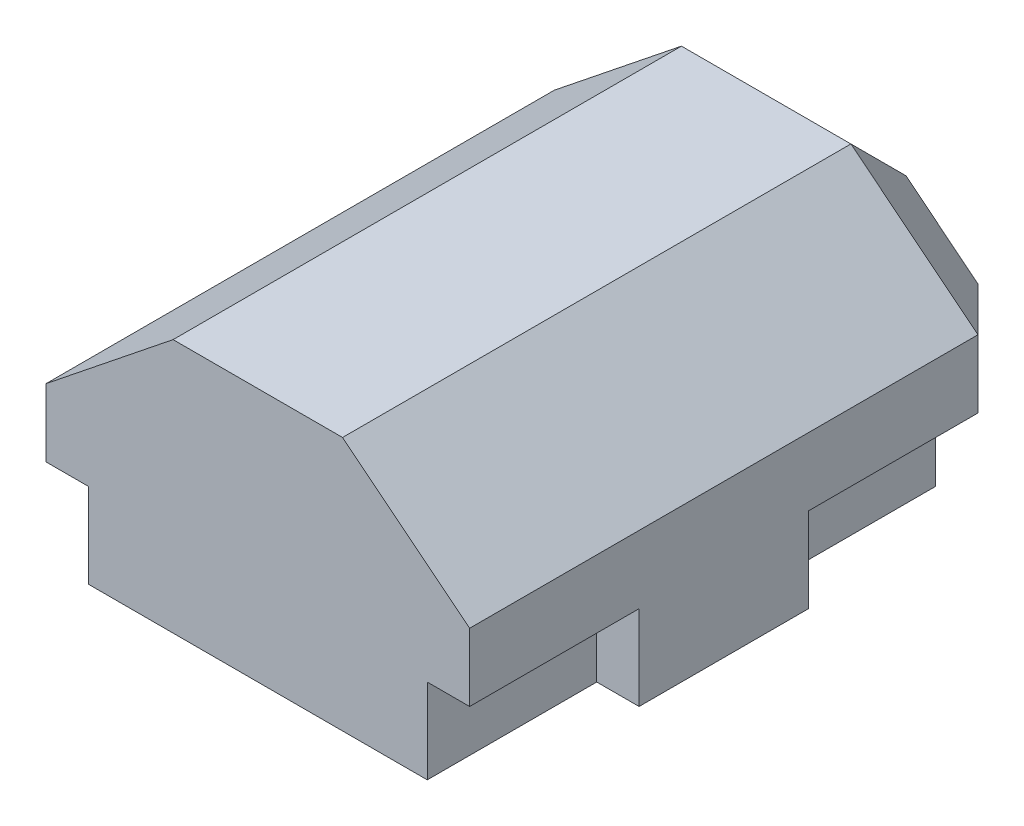
ISO-10303-21;
HEADER;
FILE_DESCRIPTION(('STEP AP214'),'2;1');
FILE_NAME('part.step','',(''),(''),'','','');
FILE_SCHEMA(('AUTOMOTIVE_DESIGN { 1 0 10303 214 1 1 1 1 }'));
ENDSEC;
DATA;
#1=APPLICATION_CONTEXT('core data for automotive mechanical design processes');
#2=APPLICATION_PROTOCOL_DEFINITION('international standard','automotive_design',2000,#1);
#3=PRODUCT_CONTEXT('',#1,'mechanical');
#4=PRODUCT('Part','Part','',(#3));
#5=PRODUCT_RELATED_PRODUCT_CATEGORY('part','',(#4));
#6=PRODUCT_DEFINITION_FORMATION('','',#4);
#7=PRODUCT_DEFINITION_CONTEXT('part definition',#1,'design');
#8=PRODUCT_DEFINITION('design','',#6,#7);
#9=PRODUCT_DEFINITION_SHAPE('','',#8);
#10=(LENGTH_UNIT() NAMED_UNIT(*) SI_UNIT(.MILLI.,.METRE.));
#11=(NAMED_UNIT(*) PLANE_ANGLE_UNIT() SI_UNIT($,.RADIAN.));
#12=(NAMED_UNIT(*) SI_UNIT($,.STERADIAN.) SOLID_ANGLE_UNIT());
#13=UNCERTAINTY_MEASURE_WITH_UNIT(LENGTH_MEASURE(1.E-05),#10,'distance_accuracy_value','');
#14=(GEOMETRIC_REPRESENTATION_CONTEXT(3) GLOBAL_UNCERTAINTY_ASSIGNED_CONTEXT((#13)) GLOBAL_UNIT_ASSIGNED_CONTEXT((#10,
#11,#12)) REPRESENTATION_CONTEXT('',''));
#15=CARTESIAN_POINT('',(0.,0.,0.));
#16=DIRECTION('',(0.,0.,1.));
#17=DIRECTION('',(1.,0.,0.));
#18=AXIS2_PLACEMENT_3D('',#15,#16,#17);
#19=CARTESIAN_POINT('',(0.,0.,0.));
#20=DIRECTION('',(0.,0.,1.));
#21=DIRECTION('',(1.,0.,0.));
#22=AXIS2_PLACEMENT_3D('',#19,#20,#21);
#23=PLANE('',#22);
#24=DIRECTION('',(-1.,0.,0.));
#25=VECTOR('',#24,1.);
#26=CARTESIAN_POINT('',(200.,-50.,0.));
#27=LINE('',#26,#25);
#28=CARTESIAN_POINT('',(200.,-50.,0.));
#29=VERTEX_POINT('',#28);
#30=CARTESIAN_POINT('',(-200.,-50.,0.));
#31=VERTEX_POINT('',#30);
#32=EDGE_CURVE('E181',#29,#31,#27,.T.);
#33=ORIENTED_EDGE('',*,*,#32,.F.);
#34=DIRECTION('',(0.,1.,0.));
#35=VECTOR('',#34,1.);
#36=CARTESIAN_POINT('',(200.,-50.,0.));
#37=LINE('',#36,#35);
#38=CARTESIAN_POINT('',(200.,-150.,0.));
#39=VERTEX_POINT('',#38);
#40=EDGE_CURVE('E185',#39,#29,#37,.T.);
#41=ORIENTED_EDGE('',*,*,#40,.F.);
#42=DIRECTION('',(1.,0.,0.));
#43=VECTOR('',#42,1.);
#44=CARTESIAN_POINT('',(200.,-150.,0.));
#45=LINE('',#44,#43);
#46=CARTESIAN_POINT('',(-200.,-150.,0.));
#47=VERTEX_POINT('',#46);
#48=EDGE_CURVE('E212',#47,#39,#45,.T.);
#49=ORIENTED_EDGE('',*,*,#48,.F.);
#50=DIRECTION('',(0.,-1.,0.));
#51=VECTOR('',#50,1.);
#52=CARTESIAN_POINT('',(-200.,-50.,0.));
#53=LINE('',#52,#51);
#54=EDGE_CURVE('E187',#31,#47,#53,.T.);
#55=ORIENTED_EDGE('',*,*,#54,.F.);
#56=EDGE_LOOP('',(#33,#41,#49,#55));
#57=FACE_BOUND('',#56,.T.);
#58=ADVANCED_FACE('F35',(#57),#23,.F.);
#59=CARTESIAN_POINT('',(-250.,-50.,600.));
#60=DIRECTION('',(0.,1.,0.));
#61=DIRECTION('',(0.,0.,1.));
#62=AXIS2_PLACEMENT_3D('',#59,#60,#61);
#63=PLANE('',#62);
#64=DIRECTION('',(0.,0.,-1.));
#65=VECTOR('',#64,1.);
#66=CARTESIAN_POINT('',(-250.,-50.,600.));
#67=LINE('',#66,#65);
#68=CARTESIAN_POINT('',(-250.,-50.,600.));
#69=VERTEX_POINT('',#68);
#70=CARTESIAN_POINT('',(-250.,-50.,400.));
#71=VERTEX_POINT('',#70);
#72=EDGE_CURVE('E192',#69,#71,#67,.T.);
#73=ORIENTED_EDGE('',*,*,#72,.T.);
#74=DIRECTION('',(-1.,0.,0.));
#75=VECTOR('',#74,1.);
#76=CARTESIAN_POINT('',(250.,-50.,400.));
#77=LINE('',#76,#75);
#78=CARTESIAN_POINT('',(-200.,-50.,400.));
#79=VERTEX_POINT('',#78);
#80=EDGE_CURVE('E312',#79,#71,#77,.T.);
#81=ORIENTED_EDGE('',*,*,#80,.F.);
#82=DIRECTION('',(0.,0.,-1.));
#83=VECTOR('',#82,1.);
#84=CARTESIAN_POINT('',(-200.,-50.,600.));
#85=LINE('',#84,#83);
#86=CARTESIAN_POINT('',(-200.,-50.,600.));
#87=VERTEX_POINT('',#86);
#88=EDGE_CURVE('E243',#87,#79,#85,.T.);
#89=ORIENTED_EDGE('',*,*,#88,.F.);
#90=DIRECTION('',(1.,0.,0.));
#91=VECTOR('',#90,1.);
#92=CARTESIAN_POINT('',(-250.,-50.,600.));
#93=LINE('',#92,#91);
#94=EDGE_CURVE('E215',#69,#87,#93,.T.);
#95=ORIENTED_EDGE('',*,*,#94,.F.);
#96=EDGE_LOOP('',(#73,#81,#89,#95));
#97=FACE_BOUND('',#96,.T.);
#98=ADVANCED_FACE('F385',(#97),#63,.F.);
#99=CARTESIAN_POINT('',(-200.,-50.,600.));
#100=DIRECTION('',(1.,0.,0.));
#101=DIRECTION('',(0.,0.,-1.));
#102=AXIS2_PLACEMENT_3D('',#99,#100,#101);
#103=PLANE('',#102);
#104=ORIENTED_EDGE('',*,*,#88,.T.);
#105=DIRECTION('',(0.,-1.,0.));
#106=VECTOR('',#105,1.);
#107=CARTESIAN_POINT('',(-200.,-49.9999999999999,400.));
#108=LINE('',#107,#106);
#109=CARTESIAN_POINT('',(-200.,-150.,400.));
#110=VERTEX_POINT('',#109);
#111=EDGE_CURVE('E328',#79,#110,#108,.T.);
#112=ORIENTED_EDGE('',*,*,#111,.T.);
#113=DIRECTION('',(0.,0.,-1.));
#114=VECTOR('',#113,1.);
#115=CARTESIAN_POINT('',(-200.,-150.,600.));
#116=LINE('',#115,#114);
#117=CARTESIAN_POINT('',(-200.,-150.,600.));
#118=VERTEX_POINT('',#117);
#119=EDGE_CURVE('E239',#118,#110,#116,.T.);
#120=ORIENTED_EDGE('',*,*,#119,.F.);
#121=DIRECTION('',(0.,-1.,0.));
#122=VECTOR('',#121,1.);
#123=CARTESIAN_POINT('',(-200.,-50.,600.));
#124=LINE('',#123,#122);
#125=EDGE_CURVE('E332',#87,#118,#124,.T.);
#126=ORIENTED_EDGE('',*,*,#125,.F.);
#127=EDGE_LOOP('',(#104,#112,#120,#126));
#128=FACE_BOUND('',#127,.T.);
#129=ADVANCED_FACE('F390',(#128),#103,.F.);
#130=CARTESIAN_POINT('',(200.,-50.,600.));
#131=DIRECTION('',(-1.,0.,0.));
#132=DIRECTION('',(0.,0.,1.));
#133=AXIS2_PLACEMENT_3D('',#130,#131,#132);
#134=PLANE('',#133);
#135=DIRECTION('',(0.,0.,-1.));
#136=VECTOR('',#135,1.);
#137=CARTESIAN_POINT('',(200.,-150.,600.));
#138=LINE('',#137,#136);
#139=CARTESIAN_POINT('',(200.,-150.,600.));
#140=VERTEX_POINT('',#139);
#141=CARTESIAN_POINT('',(200.,-150.,400.));
#142=VERTEX_POINT('',#141);
#143=EDGE_CURVE('E235',#140,#142,#138,.T.);
#144=ORIENTED_EDGE('',*,*,#143,.T.);
#145=DIRECTION('',(0.,1.,0.));
#146=VECTOR('',#145,1.);
#147=CARTESIAN_POINT('',(200.,-49.9999999999999,400.));
#148=LINE('',#147,#146);
#149=CARTESIAN_POINT('',(200.,-50.,400.));
#150=VERTEX_POINT('',#149);
#151=EDGE_CURVE('E325',#142,#150,#148,.T.);
#152=ORIENTED_EDGE('',*,*,#151,.T.);
#153=DIRECTION('',(0.,0.,-1.));
#154=VECTOR('',#153,1.);
#155=CARTESIAN_POINT('',(200.,-50.,600.));
#156=LINE('',#155,#154);
#157=CARTESIAN_POINT('',(200.,-50.,600.));
#158=VERTEX_POINT('',#157);
#159=EDGE_CURVE('E204',#158,#150,#156,.T.);
#160=ORIENTED_EDGE('',*,*,#159,.F.);
#161=DIRECTION('',(0.,1.,0.));
#162=VECTOR('',#161,1.);
#163=CARTESIAN_POINT('',(200.,-50.,600.));
#164=LINE('',#163,#162);
#165=EDGE_CURVE('E336',#140,#158,#164,.T.);
#166=ORIENTED_EDGE('',*,*,#165,.F.);
#167=EDGE_LOOP('',(#144,#152,#160,#166));
#168=FACE_BOUND('',#167,.T.);
#169=ADVANCED_FACE('F415',(#168),#134,.F.);
#170=CARTESIAN_POINT('',(250.,-50.,600.));
#171=DIRECTION('',(0.,1.,0.));
#172=DIRECTION('',(0.,0.,1.));
#173=AXIS2_PLACEMENT_3D('',#170,#171,#172);
#174=PLANE('',#173);
#175=ORIENTED_EDGE('',*,*,#159,.T.);
#176=CARTESIAN_POINT('',(250.,-50.,400.));
#177=VERTEX_POINT('',#176);
#178=EDGE_CURVE('E309',#177,#150,#77,.T.);
#179=ORIENTED_EDGE('',*,*,#178,.F.);
#180=DIRECTION('',(0.,0.,-1.));
#181=VECTOR('',#180,1.);
#182=CARTESIAN_POINT('',(250.,-50.,600.));
#183=LINE('',#182,#181);
#184=CARTESIAN_POINT('',(250.,-50.,600.));
#185=VERTEX_POINT('',#184);
#186=EDGE_CURVE('E205',#185,#177,#183,.T.);
#187=ORIENTED_EDGE('',*,*,#186,.F.);
#188=DIRECTION('',(1.,0.,0.));
#189=VECTOR('',#188,1.);
#190=CARTESIAN_POINT('',(250.,-50.,600.));
#191=LINE('',#190,#189);
#192=EDGE_CURVE('E338',#158,#185,#191,.T.);
#193=ORIENTED_EDGE('',*,*,#192,.F.);
#194=EDGE_LOOP('',(#175,#179,#187,#193));
#195=FACE_BOUND('',#194,.T.);
#196=ADVANCED_FACE('F412',(#195),#174,.F.);
#197=CARTESIAN_POINT('',(-250.,-50.,600.));
#198=DIRECTION('',(1.,0.,0.));
#199=DIRECTION('',(0.,0.,-1.));
#200=AXIS2_PLACEMENT_3D('',#197,#198,#199);
#201=PLANE('',#200);
#202=DIRECTION('',(0.,0.,-1.));
#203=VECTOR('',#202,1.);
#204=CARTESIAN_POINT('',(-250.,30.,600.));
#205=LINE('',#204,#203);
#206=CARTESIAN_POINT('',(-250.,30.,600.));
#207=VERTEX_POINT('',#206);
#208=CARTESIAN_POINT('',(-250.,30.,3.33066907387547E-13));
#209=VERTEX_POINT('',#208);
#210=EDGE_CURVE('E220',#207,#209,#205,.T.);
#211=ORIENTED_EDGE('',*,*,#210,.T.);
#212=DIRECTION('',(0.,-1.,0.));
#213=VECTOR('',#212,1.);
#214=CARTESIAN_POINT('',(-250.,-50.,3.19189119579733E-13));
#215=LINE('',#214,#213);
#216=CARTESIAN_POINT('',(-250.,-50.,3.33066907387547E-13));
#217=VERTEX_POINT('',#216);
#218=EDGE_CURVE('E259',#209,#217,#215,.T.);
#219=ORIENTED_EDGE('',*,*,#218,.T.);
#220=CARTESIAN_POINT('',(-250.,-50.,200.));
#221=VERTEX_POINT('',#220);
#222=EDGE_CURVE('E246',#221,#217,#67,.T.);
#223=ORIENTED_EDGE('',*,*,#222,.F.);
#224=DIRECTION('',(0.,-1.,0.));
#225=VECTOR('',#224,1.);
#226=CARTESIAN_POINT('',(-250.,-50.,200.));
#227=LINE('',#226,#225);
#228=CARTESIAN_POINT('',(-250.,-150.,200.));
#229=VERTEX_POINT('',#228);
#230=EDGE_CURVE('E286',#221,#229,#227,.T.);
#231=ORIENTED_EDGE('',*,*,#230,.T.);
#232=DIRECTION('',(0.,0.,1.));
#233=VECTOR('',#232,1.);
#234=CARTESIAN_POINT('',(-250.,-150.,200.));
#235=LINE('',#234,#233);
#236=CARTESIAN_POINT('',(-250.,-150.,400.));
#237=VERTEX_POINT('',#236);
#238=EDGE_CURVE('E292',#229,#237,#235,.T.);
#239=ORIENTED_EDGE('',*,*,#238,.T.);
#240=DIRECTION('',(0.,1.,0.));
#241=VECTOR('',#240,1.);
#242=CARTESIAN_POINT('',(-250.,-150.,400.));
#243=LINE('',#242,#241);
#244=EDGE_CURVE('E299',#237,#71,#243,.T.);
#245=ORIENTED_EDGE('',*,*,#244,.T.);
#246=ORIENTED_EDGE('',*,*,#72,.F.);
#247=DIRECTION('',(0.,-1.,0.));
#248=VECTOR('',#247,1.);
#249=CARTESIAN_POINT('',(-250.,-50.,600.));
#250=LINE('',#249,#248);
#251=EDGE_CURVE('E211',#207,#69,#250,.T.);
#252=ORIENTED_EDGE('',*,*,#251,.F.);
#253=EDGE_LOOP('',(#211,#219,#223,#231,#239,#245,#246,#252));
#254=FACE_BOUND('',#253,.T.);
#255=ADVANCED_FACE('F359',(#254),#201,.F.);
#256=CARTESIAN_POINT('',(-200.,-150.,200.));
#257=VERTEX_POINT('',#256);
#258=EDGE_CURVE('E238',#257,#47,#116,.T.);
#259=ORIENTED_EDGE('',*,*,#258,.F.);
#260=DIRECTION('',(0.,1.,0.));
#261=VECTOR('',#260,1.);
#262=CARTESIAN_POINT('',(-200.,-50.,200.));
#263=LINE('',#262,#261);
#264=CARTESIAN_POINT('',(-200.,-50.,200.));
#265=VERTEX_POINT('',#264);
#266=EDGE_CURVE('E322',#257,#265,#263,.T.);
#267=ORIENTED_EDGE('',*,*,#266,.T.);
#268=EDGE_CURVE('E242',#265,#31,#85,.T.);
#269=ORIENTED_EDGE('',*,*,#268,.T.);
#270=ORIENTED_EDGE('',*,*,#54,.T.);
#271=EDGE_LOOP('',(#259,#267,#269,#270));
#272=FACE_BOUND('',#271,.T.);
#273=ADVANCED_FACE('F348',(#272),#103,.F.);
#274=CARTESIAN_POINT('',(200.,-150.,600.));
#275=DIRECTION('',(0.,1.,0.));
#276=DIRECTION('',(0.,0.,1.));
#277=AXIS2_PLACEMENT_3D('',#274,#275,#276);
#278=PLANE('',#277);
#279=CARTESIAN_POINT('',(200.,-150.,200.));
#280=VERTEX_POINT('',#279);
#281=EDGE_CURVE('E209',#280,#39,#138,.T.);
#282=ORIENTED_EDGE('',*,*,#281,.F.);
#283=DIRECTION('',(-1.,0.,0.));
#284=VECTOR('',#283,1.);
#285=CARTESIAN_POINT('',(250.,-150.,200.));
#286=LINE('',#285,#284);
#287=CARTESIAN_POINT('',(250.,-150.,200.));
#288=VERTEX_POINT('',#287);
#289=EDGE_CURVE('E317',#288,#280,#286,.T.);
#290=ORIENTED_EDGE('',*,*,#289,.F.);
#291=DIRECTION('',(0.,0.,1.));
#292=VECTOR('',#291,1.);
#293=CARTESIAN_POINT('',(250.,-150.,200.));
#294=LINE('',#293,#292);
#295=CARTESIAN_POINT('',(250.,-150.,400.));
#296=VERTEX_POINT('',#295);
#297=EDGE_CURVE('E298',#288,#296,#294,.T.);
#298=ORIENTED_EDGE('',*,*,#297,.T.);
#299=DIRECTION('',(-1.,0.,0.));
#300=VECTOR('',#299,1.);
#301=CARTESIAN_POINT('',(250.,-150.,400.));
#302=LINE('',#301,#300);
#303=EDGE_CURVE('E313',#296,#142,#302,.T.);
#304=ORIENTED_EDGE('',*,*,#303,.T.);
#305=ORIENTED_EDGE('',*,*,#143,.F.);
#306=DIRECTION('',(1.,0.,0.));
#307=VECTOR('',#306,1.);
#308=CARTESIAN_POINT('',(200.,-150.,600.));
#309=LINE('',#308,#307);
#310=EDGE_CURVE('E334',#118,#140,#309,.T.);
#311=ORIENTED_EDGE('',*,*,#310,.F.);
#312=ORIENTED_EDGE('',*,*,#119,.T.);
#313=EDGE_CURVE('E316',#110,#237,#302,.T.);
#314=ORIENTED_EDGE('',*,*,#313,.T.);
#315=ORIENTED_EDGE('',*,*,#238,.F.);
#316=EDGE_CURVE('E319',#257,#229,#286,.T.);
#317=ORIENTED_EDGE('',*,*,#316,.F.);
#318=ORIENTED_EDGE('',*,*,#258,.T.);
#319=ORIENTED_EDGE('',*,*,#48,.T.);
#320=EDGE_LOOP('',(#282,#290,#298,#304,#305,#311,#312,#314,#315,#317,#318,#319));
#321=FACE_BOUND('',#320,.T.);
#322=ADVANCED_FACE('F350',(#321),#278,.F.);
#323=CARTESIAN_POINT('',(200.,-50.,200.));
#324=VERTEX_POINT('',#323);
#325=EDGE_CURVE('E196',#324,#29,#156,.T.);
#326=ORIENTED_EDGE('',*,*,#325,.F.);
#327=DIRECTION('',(0.,-1.,0.));
#328=VECTOR('',#327,1.);
#329=CARTESIAN_POINT('',(200.,-50.,200.));
#330=LINE('',#329,#328);
#331=EDGE_CURVE('E311',#324,#280,#330,.T.);
#332=ORIENTED_EDGE('',*,*,#331,.T.);
#333=ORIENTED_EDGE('',*,*,#281,.T.);
#334=ORIENTED_EDGE('',*,*,#40,.T.);
#335=EDGE_LOOP('',(#326,#332,#333,#334));
#336=FACE_BOUND('',#335,.T.);
#337=ADVANCED_FACE('F207',(#336),#134,.F.);
#338=ORIENTED_EDGE('',*,*,#222,.T.);
#339=DIRECTION('',(0.707106781186546,0.,-0.707106781186549));
#340=VECTOR('',#339,1.);
#341=CARTESIAN_POINT('',(-150.,-50.,-100.));
#342=LINE('',#341,#340);
#343=CARTESIAN_POINT('',(-150.,-50.,-100.));
#344=VERTEX_POINT('',#343);
#345=EDGE_CURVE('E263',#217,#344,#342,.T.);
#346=ORIENTED_EDGE('',*,*,#345,.T.);
#347=DIRECTION('',(-1.,0.,0.));
#348=VECTOR('',#347,1.);
#349=CARTESIAN_POINT('',(-200.,-50.,-100.));
#350=LINE('',#349,#348);
#351=CARTESIAN_POINT('',(150.,-50.,-100.));
#352=VERTEX_POINT('',#351);
#353=EDGE_CURVE('E281',#352,#344,#350,.T.);
#354=ORIENTED_EDGE('',*,*,#353,.F.);
#355=DIRECTION('',(0.707106781186546,0.,0.707106781186549));
#356=VECTOR('',#355,1.);
#357=CARTESIAN_POINT('',(150.,-50.,-100.));
#358=LINE('',#357,#356);
#359=CARTESIAN_POINT('',(250.,-50.,3.33066907387547E-13));
#360=VERTEX_POINT('',#359);
#361=EDGE_CURVE('E261',#352,#360,#358,.T.);
#362=ORIENTED_EDGE('',*,*,#361,.T.);
#363=CARTESIAN_POINT('',(250.,-50.,200.));
#364=VERTEX_POINT('',#363);
#365=EDGE_CURVE('E231',#364,#360,#183,.T.);
#366=ORIENTED_EDGE('',*,*,#365,.F.);
#367=DIRECTION('',(-1.,0.,0.));
#368=VECTOR('',#367,1.);
#369=CARTESIAN_POINT('',(250.,-50.,200.));
#370=LINE('',#369,#368);
#371=EDGE_CURVE('E201',#364,#324,#370,.T.);
#372=ORIENTED_EDGE('',*,*,#371,.T.);
#373=ORIENTED_EDGE('',*,*,#325,.T.);
#374=ORIENTED_EDGE('',*,*,#32,.T.);
#375=ORIENTED_EDGE('',*,*,#268,.F.);
#376=EDGE_CURVE('E303',#265,#221,#370,.T.);
#377=ORIENTED_EDGE('',*,*,#376,.T.);
#378=EDGE_LOOP('',(#338,#346,#354,#362,#366,#372,#373,#374,#375,#377));
#379=FACE_BOUND('',#378,.T.);
#380=ADVANCED_FACE('F198',(#379),#174,.F.);
#381=CARTESIAN_POINT('',(250.,-50.,600.));
#382=DIRECTION('',(-1.,0.,0.));
#383=DIRECTION('',(0.,0.,1.));
#384=AXIS2_PLACEMENT_3D('',#381,#382,#383);
#385=PLANE('',#384);
#386=ORIENTED_EDGE('',*,*,#365,.T.);
#387=DIRECTION('',(0.,1.,0.));
#388=VECTOR('',#387,1.);
#389=CARTESIAN_POINT('',(250.,30.,3.19189119579733E-13));
#390=LINE('',#389,#388);
#391=CARTESIAN_POINT('',(250.,30.,3.33066907387547E-13));
#392=VERTEX_POINT('',#391);
#393=EDGE_CURVE('E45',#360,#392,#390,.T.);
#394=ORIENTED_EDGE('',*,*,#393,.T.);
#395=DIRECTION('',(0.,0.,-1.));
#396=VECTOR('',#395,1.);
#397=CARTESIAN_POINT('',(250.,30.,600.));
#398=LINE('',#397,#396);
#399=CARTESIAN_POINT('',(250.,30.,600.));
#400=VERTEX_POINT('',#399);
#401=EDGE_CURVE('E229',#400,#392,#398,.T.);
#402=ORIENTED_EDGE('',*,*,#401,.F.);
#403=DIRECTION('',(0.,1.,0.));
#404=VECTOR('',#403,1.);
#405=CARTESIAN_POINT('',(250.,-50.,600.));
#406=LINE('',#405,#404);
#407=EDGE_CURVE('E340',#185,#400,#406,.T.);
#408=ORIENTED_EDGE('',*,*,#407,.F.);
#409=ORIENTED_EDGE('',*,*,#186,.T.);
#410=DIRECTION('',(0.,1.,0.));
#411=VECTOR('',#410,1.);
#412=CARTESIAN_POINT('',(250.,-150.,400.));
#413=LINE('',#412,#411);
#414=EDGE_CURVE('E302',#296,#177,#413,.T.);
#415=ORIENTED_EDGE('',*,*,#414,.F.);
#416=ORIENTED_EDGE('',*,*,#297,.F.);
#417=DIRECTION('',(0.,-1.,0.));
#418=VECTOR('',#417,1.);
#419=CARTESIAN_POINT('',(250.,-50.,200.));
#420=LINE('',#419,#418);
#421=EDGE_CURVE('E295',#364,#288,#420,.T.);
#422=ORIENTED_EDGE('',*,*,#421,.F.);
#423=EDGE_LOOP('',(#386,#394,#402,#408,#409,#415,#416,#422));
#424=FACE_BOUND('',#423,.T.);
#425=ADVANCED_FACE('F407',(#424),#385,.F.);
#426=CARTESIAN_POINT('',(250.,30.,600.));
#427=DIRECTION('',(-0.624695047554425,-0.78086880944303,0.));
#428=DIRECTION('',(0.78086880944303,-0.624695047554425,0.));
#429=AXIS2_PLACEMENT_3D('',#426,#427,#428);
#430=PLANE('',#429);
#431=ORIENTED_EDGE('',*,*,#401,.T.);
#432=DIRECTION('',(-0.78086880944303,0.624695047554425,0.));
#433=VECTOR('',#432,1.);
#434=CARTESIAN_POINT('',(100.,150.,3.44563643239012E-13));
#435=LINE('',#434,#433);
#436=CARTESIAN_POINT('',(100.,150.,3.33066907387547E-13));
#437=VERTEX_POINT('',#436);
#438=EDGE_CURVE('E11',#392,#437,#435,.T.);
#439=ORIENTED_EDGE('',*,*,#438,.T.);
#440=DIRECTION('',(0.,0.,-1.));
#441=VECTOR('',#440,1.);
#442=CARTESIAN_POINT('',(100.,150.,600.));
#443=LINE('',#442,#441);
#444=CARTESIAN_POINT('',(100.,150.,600.));
#445=VERTEX_POINT('',#444);
#446=EDGE_CURVE('E227',#445,#437,#443,.T.);
#447=ORIENTED_EDGE('',*,*,#446,.F.);
#448=DIRECTION('',(-0.78086880944303,0.624695047554425,0.));
#449=VECTOR('',#448,1.);
#450=CARTESIAN_POINT('',(250.,30.,600.));
#451=LINE('',#450,#449);
#452=EDGE_CURVE('E342',#400,#445,#451,.T.);
#453=ORIENTED_EDGE('',*,*,#452,.F.);
#454=EDGE_LOOP('',(#431,#439,#447,#453));
#455=FACE_BOUND('',#454,.T.);
#456=ADVANCED_FACE('F403',(#455),#430,.F.);
#457=CARTESIAN_POINT('',(100.,150.,600.));
#458=DIRECTION('',(0.,-1.,0.));
#459=DIRECTION('',(0.,0.,-1.));
#460=AXIS2_PLACEMENT_3D('',#457,#458,#459);
#461=PLANE('',#460);
#462=ORIENTED_EDGE('',*,*,#446,.T.);
#463=DIRECTION('',(-1.,0.,0.));
#464=VECTOR('',#463,1.);
#465=CARTESIAN_POINT('',(-100.,150.,3.19189119579733E-13));
#466=LINE('',#465,#464);
#467=CARTESIAN_POINT('',(-100.,150.,3.33066907387547E-13));
#468=VERTEX_POINT('',#467);
#469=EDGE_CURVE('E267',#437,#468,#466,.T.);
#470=ORIENTED_EDGE('',*,*,#469,.T.);
#471=DIRECTION('',(0.,0.,-1.));
#472=VECTOR('',#471,1.);
#473=CARTESIAN_POINT('',(-100.,150.,600.));
#474=LINE('',#473,#472);
#475=CARTESIAN_POINT('',(-100.,150.,600.));
#476=VERTEX_POINT('',#475);
#477=EDGE_CURVE('E223',#476,#468,#474,.T.);
#478=ORIENTED_EDGE('',*,*,#477,.F.);
#479=DIRECTION('',(-1.,0.,0.));
#480=VECTOR('',#479,1.);
#481=CARTESIAN_POINT('',(100.,150.,600.));
#482=LINE('',#481,#480);
#483=EDGE_CURVE('E344',#445,#476,#482,.T.);
#484=ORIENTED_EDGE('',*,*,#483,.F.);
#485=EDGE_LOOP('',(#462,#470,#478,#484));
#486=FACE_BOUND('',#485,.T.);
#487=ADVANCED_FACE('F399',(#486),#461,.F.);
#488=CARTESIAN_POINT('',(-250.,30.,600.));
#489=DIRECTION('',(0.624695047554425,-0.78086880944303,0.));
#490=DIRECTION('',(0.78086880944303,0.624695047554425,0.));
#491=AXIS2_PLACEMENT_3D('',#488,#489,#490);
#492=PLANE('',#491);
#493=ORIENTED_EDGE('',*,*,#477,.T.);
#494=DIRECTION('',(-0.78086880944303,-0.624695047554425,0.));
#495=VECTOR('',#494,1.);
#496=CARTESIAN_POINT('',(-250.,30.,3.15818061310972E-13));
#497=LINE('',#496,#495);
#498=EDGE_CURVE('E265',#468,#209,#497,.T.);
#499=ORIENTED_EDGE('',*,*,#498,.T.);
#500=ORIENTED_EDGE('',*,*,#210,.F.);
#501=DIRECTION('',(-0.78086880944303,-0.624695047554425,0.));
#502=VECTOR('',#501,1.);
#503=CARTESIAN_POINT('',(-250.,30.,600.));
#504=LINE('',#503,#502);
#505=EDGE_CURVE('E224',#476,#207,#504,.T.);
#506=ORIENTED_EDGE('',*,*,#505,.F.);
#507=EDGE_LOOP('',(#493,#499,#500,#506));
#508=FACE_BOUND('',#507,.T.);
#509=ADVANCED_FACE('F396',(#508),#492,.F.);
#510=CARTESIAN_POINT('',(0.,0.,600.));
#511=DIRECTION('',(0.,0.,1.));
#512=DIRECTION('',(1.,0.,0.));
#513=AXIS2_PLACEMENT_3D('',#510,#511,#512);
#514=PLANE('',#513);
#515=ORIENTED_EDGE('',*,*,#251,.T.);
#516=ORIENTED_EDGE('',*,*,#94,.T.);
#517=ORIENTED_EDGE('',*,*,#125,.T.);
#518=ORIENTED_EDGE('',*,*,#310,.T.);
#519=ORIENTED_EDGE('',*,*,#165,.T.);
#520=ORIENTED_EDGE('',*,*,#192,.T.);
#521=ORIENTED_EDGE('',*,*,#407,.T.);
#522=ORIENTED_EDGE('',*,*,#452,.T.);
#523=ORIENTED_EDGE('',*,*,#483,.T.);
#524=ORIENTED_EDGE('',*,*,#505,.T.);
#525=EDGE_LOOP('',(#515,#516,#517,#518,#519,#520,#521,#522,#523,#524));
#526=FACE_BOUND('',#525,.T.);
#527=ADVANCED_FACE('F395',(#526),#514,.T.);
#528=CARTESIAN_POINT('',(250.,-50.,200.));
#529=DIRECTION('',(0.,0.,-1.));
#530=DIRECTION('',(-1.,0.,0.));
#531=AXIS2_PLACEMENT_3D('',#528,#529,#530);
#532=PLANE('',#531);
#533=ORIENTED_EDGE('',*,*,#331,.F.);
#534=ORIENTED_EDGE('',*,*,#371,.F.);
#535=ORIENTED_EDGE('',*,*,#421,.T.);
#536=ORIENTED_EDGE('',*,*,#289,.T.);
#537=EDGE_LOOP('',(#533,#534,#535,#536));
#538=FACE_BOUND('',#537,.T.);
#539=ADVANCED_FACE('F382',(#538),#532,.T.);
#540=CARTESIAN_POINT('',(250.,-150.,400.));
#541=DIRECTION('',(0.,0.,1.));
#542=DIRECTION('',(0.,-1.,0.));
#543=AXIS2_PLACEMENT_3D('',#540,#541,#542);
#544=PLANE('',#543);
#545=ORIENTED_EDGE('',*,*,#151,.F.);
#546=ORIENTED_EDGE('',*,*,#303,.F.);
#547=ORIENTED_EDGE('',*,*,#414,.T.);
#548=ORIENTED_EDGE('',*,*,#178,.T.);
#549=EDGE_LOOP('',(#545,#546,#547,#548));
#550=FACE_BOUND('',#549,.T.);
#551=ADVANCED_FACE('F560',(#550),#544,.T.);
#552=ORIENTED_EDGE('',*,*,#111,.F.);
#553=ORIENTED_EDGE('',*,*,#80,.T.);
#554=ORIENTED_EDGE('',*,*,#244,.F.);
#555=ORIENTED_EDGE('',*,*,#313,.F.);
#556=EDGE_LOOP('',(#552,#553,#554,#555));
#557=FACE_BOUND('',#556,.T.);
#558=ADVANCED_FACE('F380',(#557),#544,.T.);
#559=ORIENTED_EDGE('',*,*,#266,.F.);
#560=ORIENTED_EDGE('',*,*,#316,.T.);
#561=ORIENTED_EDGE('',*,*,#230,.F.);
#562=ORIENTED_EDGE('',*,*,#376,.F.);
#563=EDGE_LOOP('',(#559,#560,#561,#562));
#564=FACE_BOUND('',#563,.T.);
#565=ADVANCED_FACE('F354',(#564),#532,.T.);
#566=CARTESIAN_POINT('',(0.,0.,-100.));
#567=DIRECTION('',(0.,0.,-1.));
#568=DIRECTION('',(-1.,0.,0.));
#569=AXIS2_PLACEMENT_3D('',#566,#567,#568);
#570=PLANE('',#569);
#571=ORIENTED_EDGE('',*,*,#353,.T.);
#572=DIRECTION('',(0.,1.,0.));
#573=VECTOR('',#572,1.);
#574=CARTESIAN_POINT('',(-150.,30.,-100.));
#575=LINE('',#574,#573);
#576=CARTESIAN_POINT('',(-150.,-18.062484748657,-100.));
#577=VERTEX_POINT('',#576);
#578=EDGE_CURVE('E256',#344,#577,#575,.T.);
#579=ORIENTED_EDGE('',*,*,#578,.T.);
#580=DIRECTION('',(0.78086880944303,0.624695047554425,0.));
#581=VECTOR('',#580,1.);
#582=CARTESIAN_POINT('',(-37.5304952445576,71.913119055697,-100.));
#583=LINE('',#582,#581);
#584=CARTESIAN_POINT('',(-64.9218940641788,50.,-100.));
#585=VERTEX_POINT('',#584);
#586=EDGE_CURVE('E254',#577,#585,#583,.T.);
#587=ORIENTED_EDGE('',*,*,#586,.T.);
#588=DIRECTION('',(1.,0.,0.));
#589=VECTOR('',#588,1.);
#590=CARTESIAN_POINT('',(100.,50.,-100.));
#591=LINE('',#590,#589);
#592=CARTESIAN_POINT('',(64.9218940641787,50.,-100.));
#593=VERTEX_POINT('',#592);
#594=EDGE_CURVE('E252',#585,#593,#591,.T.);
#595=ORIENTED_EDGE('',*,*,#594,.T.);
#596=DIRECTION('',(0.78086880944303,-0.624695047554425,0.));
#597=VECTOR('',#596,1.);
#598=CARTESIAN_POINT('',(187.530495244557,-48.0868809443031,-100.));
#599=LINE('',#598,#597);
#600=CARTESIAN_POINT('',(150.,-18.062484748657,-100.));
#601=VERTEX_POINT('',#600);
#602=EDGE_CURVE('E191',#593,#601,#599,.T.);
#603=ORIENTED_EDGE('',*,*,#602,.T.);
#604=DIRECTION('',(0.,-1.,0.));
#605=VECTOR('',#604,1.);
#606=CARTESIAN_POINT('',(150.,-50.,-100.));
#607=LINE('',#606,#605);
#608=EDGE_CURVE('E250',#601,#352,#607,.T.);
#609=ORIENTED_EDGE('',*,*,#608,.T.);
#610=EDGE_LOOP('',(#571,#579,#587,#595,#603,#609));
#611=FACE_BOUND('',#610,.T.);
#612=ADVANCED_FACE('F371',(#611),#570,.T.);
#613=CARTESIAN_POINT('',(150.,0.,-100.));
#614=DIRECTION('',(0.707106781186549,0.,-0.707106781186547));
#615=DIRECTION('',(0.,1.,0.));
#616=AXIS2_PLACEMENT_3D('',#613,#614,#615);
#617=PLANE('',#616);
#618=ORIENTED_EDGE('',*,*,#361,.F.);
#619=ORIENTED_EDGE('',*,*,#608,.F.);
#620=DIRECTION('',(-0.669499398412275,-0.32177804625425,-0.669499398412277));
#621=VECTOR('',#620,1.);
#622=CARTESIAN_POINT('',(122.335774047564,-31.3585991278807,-127.664225952436));
#623=LINE('',#622,#621);
#624=EDGE_CURVE('E40',#392,#601,#623,.T.);
#625=ORIENTED_EDGE('',*,*,#624,.F.);
#626=ORIENTED_EDGE('',*,*,#393,.F.);
#627=EDGE_LOOP('',(#618,#619,#625,#626));
#628=FACE_BOUND('',#627,.T.);
#629=ADVANCED_FACE('F38',(#628),#617,.T.);
#630=CARTESIAN_POINT('',(49.7256171957771,62.1570214947213,-100.));
#631=DIRECTION('',(0.441726104299387,0.552157630374233,-0.707106781186547));
#632=DIRECTION('',(-0.78086880944303,0.624695047554425,0.));
#633=AXIS2_PLACEMENT_3D('',#630,#631,#632);
#634=PLANE('',#633);
#635=ORIENTED_EDGE('',*,*,#624,.T.);
#636=ORIENTED_EDGE('',*,*,#602,.F.);
#637=DIRECTION('',(0.240744456161526,0.68630973577077,0.686309735770772));
#638=VECTOR('',#637,1.);
#639=CARTESIAN_POINT('',(66.0497969599121,53.2154042119521,-96.7845957880479));
#640=LINE('',#639,#638);
#641=EDGE_CURVE('E274',#437,#593,#640,.F.);
#642=ORIENTED_EDGE('',*,*,#641,.F.);
#643=ORIENTED_EDGE('',*,*,#438,.F.);
#644=EDGE_LOOP('',(#635,#636,#642,#643));
#645=FACE_BOUND('',#644,.T.);
#646=ADVANCED_FACE('F378',(#645),#634,.T.);
#647=CARTESIAN_POINT('',(0.,50.,-100.));
#648=DIRECTION('',(0.,0.707106781186549,-0.707106781186547));
#649=DIRECTION('',(-1.,0.,0.));
#650=AXIS2_PLACEMENT_3D('',#647,#648,#649);
#651=PLANE('',#650);
#652=ORIENTED_EDGE('',*,*,#641,.T.);
#653=ORIENTED_EDGE('',*,*,#594,.F.);
#654=DIRECTION('',(-0.240744456161525,0.68630973577077,0.686309735770772));
#655=VECTOR('',#654,1.);
#656=CARTESIAN_POINT('',(-61.1591578634502,39.2732629076015,-110.726737092399));
#657=LINE('',#656,#655);
#658=EDGE_CURVE('E272',#468,#585,#657,.F.);
#659=ORIENTED_EDGE('',*,*,#658,.F.);
#660=ORIENTED_EDGE('',*,*,#469,.F.);
#661=EDGE_LOOP('',(#652,#653,#659,#660));
#662=FACE_BOUND('',#661,.T.);
#663=ADVANCED_FACE('F433',(#662),#651,.T.);
#664=CARTESIAN_POINT('',(-49.7256171957771,62.1570214947214,-100.));
#665=DIRECTION('',(-0.441726104299387,0.552157630374234,-0.707106781186547));
#666=DIRECTION('',(-0.78086880944303,-0.624695047554425,0.));
#667=AXIS2_PLACEMENT_3D('',#664,#665,#666);
#668=PLANE('',#667);
#669=ORIENTED_EDGE('',*,*,#658,.T.);
#670=ORIENTED_EDGE('',*,*,#586,.F.);
#671=DIRECTION('',(-0.669499398412275,0.321778046254249,0.669499398412277));
#672=VECTOR('',#671,1.);
#673=CARTESIAN_POINT('',(-122.335774047564,-31.3585991278806,-127.664225952436));
#674=LINE('',#673,#672);
#675=EDGE_CURVE('E270',#209,#577,#674,.F.);
#676=ORIENTED_EDGE('',*,*,#675,.F.);
#677=ORIENTED_EDGE('',*,*,#498,.F.);
#678=EDGE_LOOP('',(#669,#670,#676,#677));
#679=FACE_BOUND('',#678,.T.);
#680=ADVANCED_FACE('F369',(#679),#668,.T.);
#681=CARTESIAN_POINT('',(-150.,0.,-100.));
#682=DIRECTION('',(-0.707106781186549,0.,-0.707106781186547));
#683=DIRECTION('',(0.,-1.,0.));
#684=AXIS2_PLACEMENT_3D('',#681,#682,#683);
#685=PLANE('',#684);
#686=ORIENTED_EDGE('',*,*,#345,.F.);
#687=ORIENTED_EDGE('',*,*,#218,.F.);
#688=ORIENTED_EDGE('',*,*,#675,.T.);
#689=ORIENTED_EDGE('',*,*,#578,.F.);
#690=EDGE_LOOP('',(#686,#687,#688,#689));
#691=FACE_BOUND('',#690,.T.);
#692=ADVANCED_FACE('F365',(#691),#685,.T.);
#693=CLOSED_SHELL('',(#58,#98,#129,#169,#196,#255,#273,#322,#337,#380,#425,#456,#487,#509,#527,
#539,#551,#558,#565,#612,#629,#646,#663,#680,#692));
#694=MANIFOLD_SOLID_BREP('B2',#693);
#695=ADVANCED_BREP_SHAPE_REPRESENTATION('',(#18,#694),#14);
#696=SHAPE_DEFINITION_REPRESENTATION(#9,#695);
ENDSEC;
END-ISO-10303-21;
